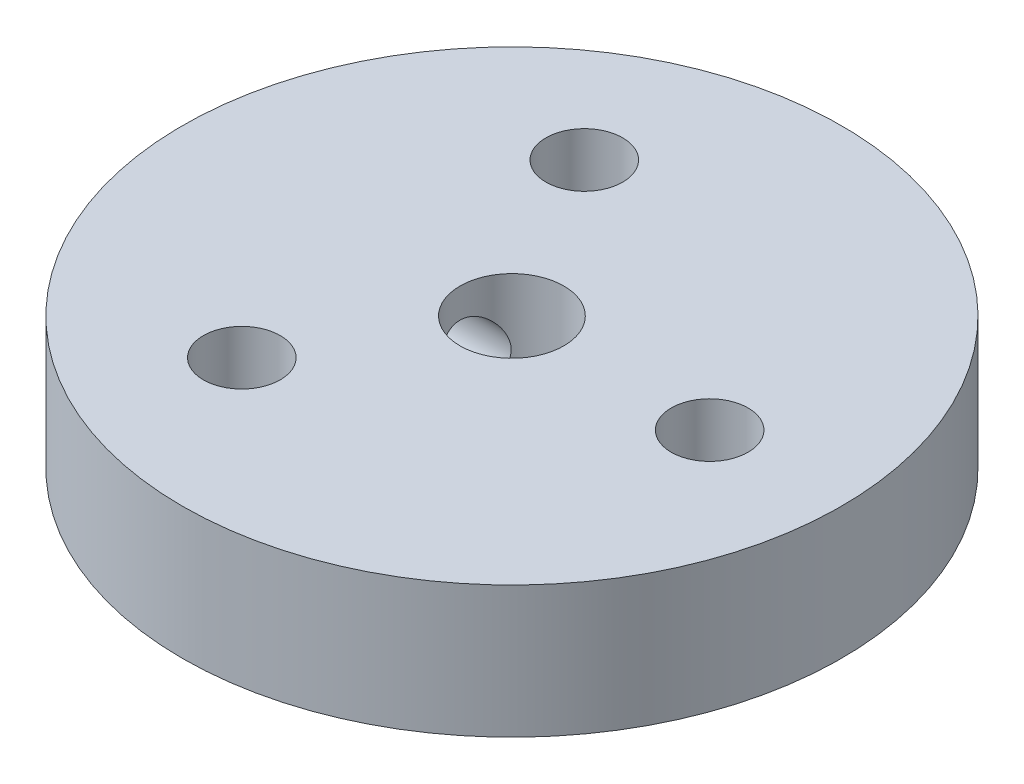
ISO-10303-21;
HEADER;
FILE_DESCRIPTION(('STEP AP214'),'2;1');
FILE_NAME('part.step','',(''),(''),'','','');
FILE_SCHEMA(('AUTOMOTIVE_DESIGN { 1 0 10303 214 1 1 1 1 }'));
ENDSEC;
DATA;
#1=APPLICATION_CONTEXT('core data for automotive mechanical design processes');
#2=APPLICATION_PROTOCOL_DEFINITION('international standard','automotive_design',2000,#1);
#3=PRODUCT_CONTEXT('',#1,'mechanical');
#4=PRODUCT('Part','Part','',(#3));
#5=PRODUCT_RELATED_PRODUCT_CATEGORY('part','',(#4));
#6=PRODUCT_DEFINITION_FORMATION('','',#4);
#7=PRODUCT_DEFINITION_CONTEXT('part definition',#1,'design');
#8=PRODUCT_DEFINITION('design','',#6,#7);
#9=PRODUCT_DEFINITION_SHAPE('','',#8);
#10=(LENGTH_UNIT() NAMED_UNIT(*) SI_UNIT(.MILLI.,.METRE.));
#11=(NAMED_UNIT(*) PLANE_ANGLE_UNIT() SI_UNIT($,.RADIAN.));
#12=(NAMED_UNIT(*) SI_UNIT($,.STERADIAN.) SOLID_ANGLE_UNIT());
#13=UNCERTAINTY_MEASURE_WITH_UNIT(LENGTH_MEASURE(1.E-05),#10,'distance_accuracy_value','');
#14=(GEOMETRIC_REPRESENTATION_CONTEXT(3) GLOBAL_UNCERTAINTY_ASSIGNED_CONTEXT((#13)) GLOBAL_UNIT_ASSIGNED_CONTEXT((#10,
#11,#12)) REPRESENTATION_CONTEXT('',''));
#15=CARTESIAN_POINT('',(0.,0.,0.));
#16=DIRECTION('',(0.,0.,1.));
#17=DIRECTION('',(1.,0.,0.));
#18=AXIS2_PLACEMENT_3D('',#15,#16,#17);
#19=CARTESIAN_POINT('',(0.,3.175,0.));
#20=DIRECTION('',(0.,1.,0.));
#21=DIRECTION('',(0.,0.,1.));
#22=AXIS2_PLACEMENT_3D('',#19,#20,#21);
#23=PLANE('',#22);
#24=CARTESIAN_POINT('',(-4.76249999999999,3.175,8.24889197104678));
#25=DIRECTION('',(0.,1.,0.));
#26=DIRECTION('',(0.,0.,1.));
#27=AXIS2_PLACEMENT_3D('',#24,#25,#26);
#28=CIRCLE('',#27,1.849999983);
#29=CARTESIAN_POINT('',(-4.76249999999999,3.175,10.0988919540468));
#30=VERTEX_POINT('',#29);
#31=EDGE_CURVE('E65',#30,#30,#28,.T.);
#32=ORIENTED_EDGE('',*,*,#31,.F.);
#33=EDGE_LOOP('',(#32));
#34=FACE_BOUND('',#33,.T.);
#35=CARTESIAN_POINT('',(0.,3.175,0.));
#36=DIRECTION('',(0.,1.,0.));
#37=DIRECTION('',(0.,0.,1.));
#38=AXIS2_PLACEMENT_3D('',#35,#36,#37);
#39=CIRCLE('',#38,2.499999953);
#40=CARTESIAN_POINT('',(0.,3.175,2.499999953));
#41=VERTEX_POINT('',#40);
#42=EDGE_CURVE('E54',#41,#41,#39,.T.);
#43=ORIENTED_EDGE('',*,*,#42,.F.);
#44=EDGE_LOOP('',(#43));
#45=FACE_BOUND('',#44,.T.);
#46=CARTESIAN_POINT('',(0.,3.175,0.));
#47=DIRECTION('',(0.,1.,0.));
#48=DIRECTION('',(0.,0.,1.));
#49=AXIS2_PLACEMENT_3D('',#46,#47,#48);
#50=CIRCLE('',#49,15.875);
#51=CARTESIAN_POINT('',(0.,3.175,15.875));
#52=VERTEX_POINT('',#51);
#53=EDGE_CURVE('E10',#52,#52,#50,.T.);
#54=ORIENTED_EDGE('',*,*,#53,.T.);
#55=EDGE_LOOP('',(#54));
#56=FACE_BOUND('',#55,.T.);
#57=CARTESIAN_POINT('',(9.525,3.175,0.));
#58=DIRECTION('',(0.,1.,0.));
#59=DIRECTION('',(0.,0.,1.));
#60=AXIS2_PLACEMENT_3D('',#57,#58,#59);
#61=CIRCLE('',#60,1.849999983);
#62=CARTESIAN_POINT('',(9.525,3.175,1.849999983));
#63=VERTEX_POINT('',#62);
#64=EDGE_CURVE('E59',#63,#63,#61,.T.);
#65=ORIENTED_EDGE('',*,*,#64,.F.);
#66=EDGE_LOOP('',(#65));
#67=FACE_BOUND('',#66,.T.);
#68=CARTESIAN_POINT('',(-4.7625,3.175,-8.24889197104678));
#69=DIRECTION('',(0.,1.,0.));
#70=DIRECTION('',(0.,0.,1.));
#71=AXIS2_PLACEMENT_3D('',#68,#69,#70);
#72=CIRCLE('',#71,1.849999983);
#73=CARTESIAN_POINT('',(-4.7625,3.175,-6.39889198804678));
#74=VERTEX_POINT('',#73);
#75=EDGE_CURVE('E71',#74,#74,#72,.T.);
#76=ORIENTED_EDGE('',*,*,#75,.F.);
#77=EDGE_LOOP('',(#76));
#78=FACE_BOUND('',#77,.T.);
#79=ADVANCED_FACE('F35',(#34,#45,#56,#67,#78),#23,.T.);
#80=CARTESIAN_POINT('',(0.,-3.175,0.));
#81=DIRECTION('',(0.,1.,0.));
#82=DIRECTION('',(0.,0.,1.));
#83=AXIS2_PLACEMENT_3D('',#80,#81,#82);
#84=PLANE('',#83);
#85=CARTESIAN_POINT('',(0.,-3.175,0.));
#86=DIRECTION('',(0.,1.,0.));
#87=DIRECTION('',(0.,0.,1.));
#88=AXIS2_PLACEMENT_3D('',#85,#86,#87);
#89=CIRCLE('',#88,15.875);
#90=CARTESIAN_POINT('',(0.,-3.175,15.875));
#91=VERTEX_POINT('',#90);
#92=EDGE_CURVE('E49',#91,#91,#89,.T.);
#93=ORIENTED_EDGE('',*,*,#92,.F.);
#94=EDGE_LOOP('',(#93));
#95=FACE_BOUND('',#94,.T.);
#96=CARTESIAN_POINT('',(0.,-3.175,0.));
#97=DIRECTION('',(0.,1.,0.));
#98=DIRECTION('',(0.,0.,1.));
#99=AXIS2_PLACEMENT_3D('',#96,#97,#98);
#100=CIRCLE('',#99,2.499999953);
#101=CARTESIAN_POINT('',(0.,-3.175,2.499999953));
#102=VERTEX_POINT('',#101);
#103=EDGE_CURVE('E56',#102,#102,#100,.T.);
#104=ORIENTED_EDGE('',*,*,#103,.T.);
#105=EDGE_LOOP('',(#104));
#106=FACE_BOUND('',#105,.T.);
#107=CARTESIAN_POINT('',(9.525,-3.175,0.));
#108=DIRECTION('',(0.,1.,0.));
#109=DIRECTION('',(0.,0.,1.));
#110=AXIS2_PLACEMENT_3D('',#107,#108,#109);
#111=CIRCLE('',#110,1.849999983);
#112=CARTESIAN_POINT('',(9.525,-3.175,1.849999983));
#113=VERTEX_POINT('',#112);
#114=EDGE_CURVE('E62',#113,#113,#111,.T.);
#115=ORIENTED_EDGE('',*,*,#114,.T.);
#116=EDGE_LOOP('',(#115));
#117=FACE_BOUND('',#116,.T.);
#118=CARTESIAN_POINT('',(-4.76249999999999,-3.175,8.24889197104678));
#119=DIRECTION('',(0.,1.,0.));
#120=DIRECTION('',(0.,0.,1.));
#121=AXIS2_PLACEMENT_3D('',#118,#119,#120);
#122=CIRCLE('',#121,1.849999983);
#123=CARTESIAN_POINT('',(-4.76249999999999,-3.175,10.0988919540468));
#124=VERTEX_POINT('',#123);
#125=EDGE_CURVE('E68',#124,#124,#122,.T.);
#126=ORIENTED_EDGE('',*,*,#125,.T.);
#127=EDGE_LOOP('',(#126));
#128=FACE_BOUND('',#127,.T.);
#129=CARTESIAN_POINT('',(-4.7625,-3.175,-8.24889197104678));
#130=DIRECTION('',(0.,1.,0.));
#131=DIRECTION('',(0.,0.,1.));
#132=AXIS2_PLACEMENT_3D('',#129,#130,#131);
#133=CIRCLE('',#132,1.849999983);
#134=CARTESIAN_POINT('',(-4.7625,-3.175,-6.39889198804678));
#135=VERTEX_POINT('',#134);
#136=EDGE_CURVE('E74',#135,#135,#133,.T.);
#137=ORIENTED_EDGE('',*,*,#136,.T.);
#138=EDGE_LOOP('',(#137));
#139=FACE_BOUND('',#138,.T.);
#140=ADVANCED_FACE('F107',(#95,#106,#117,#128,#139),#84,.F.);
#141=CARTESIAN_POINT('',(0.,3.175,0.));
#142=DIRECTION('',(0.,-1.,0.));
#143=DIRECTION('',(0.,0.,-1.));
#144=AXIS2_PLACEMENT_3D('',#141,#142,#143);
#145=CYLINDRICAL_SURFACE('',#144,15.875);
#146=CARTESIAN_POINT('',(-15.875,-1.750000056,0.));
#147=CARTESIAN_POINT('',(-15.8749987707504,-1.74999584185086,-0.0979793643530249));
#148=CARTESIAN_POINT('',(-15.8740833013667,-1.74174380277529,-0.196022150233042));
#149=CARTESIAN_POINT('',(-15.8705193526468,-1.70895155045262,-0.389385738105229));
#150=CARTESIAN_POINT('',(-15.8678690022144,-1.68439375077809,-0.484703485127764));
#151=CARTESIAN_POINT('',(-15.8611342387205,-1.61971693962202,-0.669789190422526));
#152=CARTESIAN_POINT('',(-15.8570507300743,-1.57960774040858,-0.75956060686708));
#153=CARTESIAN_POINT('',(-15.8479053217718,-1.48498669228053,-0.931078842194836));
#154=CARTESIAN_POINT('',(-15.8428436064379,-1.43047755602138,-1.01282716849133));
#155=CARTESIAN_POINT('',(-15.832283565769,-1.30835104975384,-1.16635129833459));
#156=CARTESIAN_POINT('',(-15.8267836315471,-1.24068392637024,-1.23808741687249));
#157=CARTESIAN_POINT('',(-15.8159802044649,-1.0942687401302,-1.36920942645987));
#158=CARTESIAN_POINT('',(-15.8106767210424,-1.01552014577331,-1.42859472478838));
#159=CARTESIAN_POINT('',(-15.8008505262322,-0.848924993605343,-1.53347299357972));
#160=CARTESIAN_POINT('',(-15.7963298762098,-0.76105536173159,-1.578929521488));
#161=CARTESIAN_POINT('',(-15.7886017252672,-0.578871890849666,-1.65442720826407));
#162=CARTESIAN_POINT('',(-15.7853941853144,-0.484558243488575,-1.68446882535031));
#163=CARTESIAN_POINT('',(-15.7806703494868,-0.292571858113271,-1.72816501837791));
#164=CARTESIAN_POINT('',(-15.7791472082895,-0.194914391305205,-1.74188593824553));
#165=CARTESIAN_POINT('',(-15.7779435139746,0.00132818929405485,-1.75275641347327));
#166=CARTESIAN_POINT('',(-15.7782629026333,0.099913273674305,-1.74990649247097));
#167=CARTESIAN_POINT('',(-15.7807019224249,0.29475337547144,-1.72777077884379));
#168=CARTESIAN_POINT('',(-15.7828135924459,0.391016764007342,-1.70855766836944));
#169=CARTESIAN_POINT('',(-15.7885868189893,0.57894442529153,-1.65435417633734));
#170=CARTESIAN_POINT('',(-15.7922484004842,0.670608623910321,-1.61936354056901));
#171=CARTESIAN_POINT('',(-15.8007179991703,0.846964040160319,-1.53451883504015));
#172=CARTESIAN_POINT('',(-15.8055284794751,0.931639743090616,-1.48463277281854));
#173=CARTESIAN_POINT('',(-15.8157518516358,1.09144467320651,-1.37143624395736));
#174=CARTESIAN_POINT('',(-15.8211647649281,1.16657356048189,-1.30812529954477));
#175=CARTESIAN_POINT('',(-15.8320185581079,1.30557439659657,-1.16947142581752));
#176=CARTESIAN_POINT('',(-15.8374594322491,1.36938379519243,-1.09406577254533));
#177=CARTESIAN_POINT('',(-15.847728784908,1.48344868087205,-0.933580066232353));
#178=CARTESIAN_POINT('',(-15.8525572624945,1.53370414734709,-0.848499998481936));
#179=CARTESIAN_POINT('',(-15.8610598804911,1.61923306738655,-0.671035359528453));
#180=CARTESIAN_POINT('',(-15.8647337544272,1.65450306307491,-0.578649108260965));
#181=CARTESIAN_POINT('',(-15.8705106365117,1.70901255824955,-0.389216300339645));
#182=CARTESIAN_POINT('',(-15.8726137017834,1.72825264067658,-0.292169913291171));
#183=CARTESIAN_POINT('',(-15.8750046399331,1.75007614450582,-0.096712983575378));
#184=CARTESIAN_POINT('',(-15.8753019126916,1.75274582314955,0.00168781785082944));
#185=CARTESIAN_POINT('',(-15.874073043414,1.7415797036682,0.197535415328228));
#186=CARTESIAN_POINT('',(-15.87254693142,1.72774417748232,0.294982227070652));
#187=CARTESIAN_POINT('',(-15.8678487150653,1.68403198885939,0.485904597899955));
#188=CARTESIAN_POINT('',(-15.8646807847588,1.65419599832553,0.579389580350867));
#189=CARTESIAN_POINT('',(-15.8570540340655,1.57937179861591,0.760028235948189));
#190=CARTESIAN_POINT('',(-15.8525951789162,1.53438318140011,0.847181738519446));
#191=CARTESIAN_POINT('',(-15.8428612389217,1.43031887501327,1.01307164683578));
#192=CARTESIAN_POINT('',(-15.8375829201735,1.37118684809846,1.09177251849359));
#193=CARTESIAN_POINT('',(-15.8268119373787,1.24059462690878,1.23816274044449));
#194=CARTESIAN_POINT('',(-15.8213192667711,1.1691340550484,1.30585175335472));
#195=CARTESIAN_POINT('',(-15.8107100734737,1.01553547987193,1.42859882917763));
#196=CARTESIAN_POINT('',(-15.805595310404,0.933351921211562,1.48360006057013));
#197=CARTESIAN_POINT('',(-15.7963487008554,0.760863550385964,1.57901887096793));
#198=CARTESIAN_POINT('',(-15.7922168384741,0.6705588696452,1.61943668592425));
#199=CARTESIAN_POINT('',(-15.7854152753184,0.484582147472773,1.68444740085582));
#200=CARTESIAN_POINT('',(-15.7827425148824,0.388921804954169,1.70907343448263));
#201=CARTESIAN_POINT('',(-15.7791525789664,0.194792749055371,1.74190875954436));
#202=CARTESIAN_POINT('',(-15.7782353412616,0.0963241353404615,1.75011863285375));
#203=CARTESIAN_POINT('',(-15.7782618172443,-0.100061266541459,1.74987952324859));
#204=CARTESIAN_POINT('',(-15.7791955582548,-0.197978176891494,1.74151981373045));
#205=CARTESIAN_POINT('',(-15.7827974525154,-0.391007035651755,1.70856673640226));
#206=CARTESIAN_POINT('',(-15.7854656071144,-0.486118981880618,1.68397335596795));
#207=CARTESIAN_POINT('',(-15.7922328084822,-0.670833051399155,1.61927697921681));
#208=CARTESIAN_POINT('',(-15.7963315528257,-0.760436334510245,1.57917726073254));
#209=CARTESIAN_POINT('',(-15.8054986823344,-0.931655560551822,1.48461545462339));
#210=CARTESIAN_POINT('',(-15.8105670688637,-1.01327149224439,1.43015334679154));
#211=CARTESIAN_POINT('',(-15.8211351459263,-1.16665650117076,1.30807874455527));
#212=CARTESIAN_POINT('',(-15.826636932568,-1.23837243958712,1.24039966058607));
#213=CARTESIAN_POINT('',(-15.8374329558805,-1.36946626129314,1.09394780586495));
#214=CARTESIAN_POINT('',(-15.8427271428449,-1.42884120419813,1.01517239876964));
#215=CARTESIAN_POINT('',(-15.8525284351924,-1.53371293329698,0.848499748931197));
#216=CARTESIAN_POINT('',(-15.8570331331814,-1.57916757669441,0.760575865487707));
#217=CARTESIAN_POINT('',(-15.8647225791226,-1.65460517533266,0.578347062586761));
#218=CARTESIAN_POINT('',(-15.8679087939638,-1.68460533373755,0.484049371034498));
#219=CARTESIAN_POINT('',(-15.8718140508065,-1.72091570865995,0.324362345388978));
#220=CARTESIAN_POINT('',(-15.8730031159235,-1.73180714458004,0.25998886124424));
#221=CARTESIAN_POINT('',(-15.8745964975978,-1.74635070179433,0.130419616769645));
#222=CARTESIAN_POINT('',(-15.8750008182989,-1.75000286131598,0.0652238607836776));
#223=CARTESIAN_POINT('',(-15.875,-1.750000056,0.));
#224=B_SPLINE_CURVE_WITH_KNOTS('',3,(#146,#147,#148,#149,#150,#151,#152,#153,#154,#155,#156,
#157,#158,#159,#160,#161,#162,#163,#164,#165,#166,#167,#168,#169,#170,#171,#172,#173,#174,#175,
#176,#177,#178,#179,#180,#181,#182,#183,#184,#185,#186,#187,#188,#189,#190,#191,#192,#193,#194,
#195,#196,#197,#198,#199,#200,#201,#202,#203,#204,#205,#206,#207,#208,#209,#210,#211,#212,#213,
#214,#215,#216,#217,#218,#219,#220,#221,#222,#223),.UNSPECIFIED.,.T.,.F.,(4,2,2,2,2,2,2,2,2,2,2,
2,2,2,2,2,2,2,2,2,2,2,2,2,2,2,2,2,2,2,2,2,2,2,2,2,2,2,4),(0.,0.293699894116223,
0.587717071206363,0.881549037129714,1.17532569050457,1.47023557519066,1.76515960946012,
2.06084880673068,2.3565292139345,2.65100352198026,2.94546852470618,3.23863235130914,
3.53180090159398,3.82560370616381,4.11941696852504,4.41480640062226,4.71019628185575,
5.00565428691476,5.30110154693553,5.59500955739081,5.88891272549456,6.18207233192447,
6.475239833383,6.76959515519251,7.06395949380344,7.3596178087775,7.65527133996119,
7.95030249595024,8.24532319430869,8.53875870419187,8.83219444226791,9.12556818582979,
9.41894234215225,9.71383458954611,10.0087970180838,10.3046437941381,10.6001605327694,
10.7956745809476,10.9911875966985),.UNSPECIFIED.);
#225=CARTESIAN_POINT('',(-15.875,-1.750000056,0.));
#226=VERTEX_POINT('',#225);
#227=EDGE_CURVE('E77',#226,#226,#224,.T.);
#228=ORIENTED_EDGE('',*,*,#227,.T.);
#229=EDGE_LOOP('',(#228));
#230=FACE_BOUND('',#229,.T.);
#231=ORIENTED_EDGE('',*,*,#53,.F.);
#232=EDGE_LOOP('',(#231));
#233=FACE_BOUND('',#232,.T.);
#234=ORIENTED_EDGE('',*,*,#92,.T.);
#235=EDGE_LOOP('',(#234));
#236=FACE_BOUND('',#235,.T.);
#237=ADVANCED_FACE('F37',(#230,#233,#236),#145,.T.);
#238=CARTESIAN_POINT('',(0.,3.175,0.));
#239=DIRECTION('',(0.,-1.,0.));
#240=DIRECTION('',(0.,0.,-1.));
#241=AXIS2_PLACEMENT_3D('',#238,#239,#240);
#242=CYLINDRICAL_SURFACE('',#241,2.499999953);
#243=CARTESIAN_POINT('',(-1.78535698643156,0.,-1.750000056));
#244=CARTESIAN_POINT('',(-1.78536353160684,0.0840009862376694,-1.74999674071223));
#245=CARTESIAN_POINT('',(-1.79140289005451,0.168020441562607,-1.74389526812276));
#246=CARTESIAN_POINT('',(-1.81428196053339,0.332943841578731,-1.72006716194955));
#247=CARTESIAN_POINT('',(-1.83114568410368,0.413840434860148,-1.70231468112262));
#248=CARTESIAN_POINT('',(-1.87249926755723,0.569514942858015,-1.65670504353427));
#249=CARTESIAN_POINT('',(-1.89690309611459,0.644350430591283,-1.62896132184663));
#250=CARTESIAN_POINT('',(-1.95043463035388,0.788133184100334,-1.56446810095859));
#251=CARTESIAN_POINT('',(-1.97956266497265,0.857080039351942,-1.52771797456944));
#252=CARTESIAN_POINT('',(-2.04535092334424,1.00034782595924,-1.43878627636313));
#253=CARTESIAN_POINT('',(-2.08243690603078,1.07349541386344,-1.38502935864329));
#254=CARTESIAN_POINT('',(-2.1564207321596,1.21078035386626,-1.2667785172882));
#255=CARTESIAN_POINT('',(-2.19331828562269,1.27490643185664,-1.20227137517678));
#256=CARTESIAN_POINT('',(-2.2699691649691,1.40296570024856,-1.05144380920934));
#257=CARTESIAN_POINT('',(-2.30917471093664,1.46508818111615,-0.963279743678919));
#258=CARTESIAN_POINT('',(-2.37911877937965,1.57301938685324,-0.774507191497755));
#259=CARTESIAN_POINT('',(-2.40987420704006,1.61886073812036,-0.673924143429612));
#260=CARTESIAN_POINT('',(-2.45245931674288,1.68149475615454,-0.491641658281999));
#261=CARTESIAN_POINT('',(-2.46715483216543,1.70278494864081,-0.412145290151232));
#262=CARTESIAN_POINT('',(-2.48881527088418,1.7340219095182,-0.249941886516342));
#263=CARTESIAN_POINT('',(-2.49578636657199,1.74397773509468,-0.167237469264432));
#264=CARTESIAN_POINT('',(-2.50138888439035,1.75198596784507,-0.000805981701546988));
#265=CARTESIAN_POINT('',(-2.50000410962763,1.75001525677839,0.0829227605929475));
#266=CARTESIAN_POINT('',(-2.48898575533895,1.73423812035354,0.248708344722488));
#267=CARTESIAN_POINT('',(-2.4793498755541,1.72042839449088,0.330764713798533));
#268=CARTESIAN_POINT('',(-2.45297590516598,1.68219405100126,0.489091661657778));
#269=CARTESIAN_POINT('',(-2.43640489589069,1.65801884318785,0.565451538680731));
#270=CARTESIAN_POINT('',(-2.39742412960482,1.60018691633619,0.712866111720709));
#271=CARTESIAN_POINT('',(-2.37501322563591,1.5665283346528,0.783919762061208));
#272=CARTESIAN_POINT('',(-2.32302565677279,1.48659829896808,0.927364941252995));
#273=CARTESIAN_POINT('',(-2.29292703783558,1.43933520673159,0.999011529654068));
#274=CARTESIAN_POINT('',(-2.22936299205402,1.33575197009653,1.13380162872956));
#275=CARTESIAN_POINT('',(-2.1958939538483,1.27942207123081,1.19693584546015));
#276=CARTESIAN_POINT('',(-2.12170402947656,1.14786844878418,1.32466885392253));
#277=CARTESIAN_POINT('',(-2.08075551208748,1.07106708517545,1.3875155687759));
#278=CARTESIAN_POINT('',(-2.00128397513863,0.90707550247114,1.49986259990245));
#279=CARTESIAN_POINT('',(-1.96276033081695,0.819887976225726,1.54936636482748));
#280=CARTESIAN_POINT('',(-1.90133160150142,0.657139157095294,1.62379390045516));
#281=CARTESIAN_POINT('',(-1.87687563694531,0.583562177458264,1.65175510639622));
#282=CARTESIAN_POINT('',(-1.83530085153893,0.431453142490078,1.69783363759576));
#283=CARTESIAN_POINT('',(-1.81816832181888,0.352930663818078,1.71596937250885));
#284=CARTESIAN_POINT('',(-1.79384384467562,0.19171004720726,1.74139488231661));
#285=CARTESIAN_POINT('',(-1.7867543349786,0.108977672211668,1.74857294672399));
#286=CARTESIAN_POINT('',(-1.78434042088011,-0.056828961830422,1.75103864622662));
#287=CARTESIAN_POINT('',(-1.78901172732784,-0.139903085209793,1.74633061615974));
#288=CARTESIAN_POINT('',(-1.80768747695056,-0.291790636324837,1.72696246458513));
#289=CARTESIAN_POINT('',(-1.82030450288525,-0.360981344484975,1.71377649609293));
#290=CARTESIAN_POINT('',(-1.85179977176652,-0.495961783793232,1.6796950702078));
#291=CARTESIAN_POINT('',(-1.8706846136517,-0.561747845690816,1.65879148486562));
#292=CARTESIAN_POINT('',(-1.92274145146181,-0.719229601753332,1.5985290510106));
#293=CARTESIAN_POINT('',(-1.95845299526844,-0.808531913299251,1.55511514099229));
#294=CARTESIAN_POINT('',(-2.03399586921551,-0.977427132676097,1.45492658079318));
#295=CARTESIAN_POINT('',(-2.07383516526639,-1.05700059542363,1.39812581647788));
#296=CARTESIAN_POINT('',(-2.15418657793027,-1.20710418905457,1.2709252101808));
#297=CARTESIAN_POINT('',(-2.19469720316951,-1.27743531414488,1.20028895636523));
#298=CARTESIAN_POINT('',(-2.2718540255458,-1.4058614669604,1.04691357933904));
#299=CARTESIAN_POINT('',(-2.30850584900416,-1.46397443625129,0.964192508965829));
#300=CARTESIAN_POINT('',(-2.36919517687531,-1.55776856959566,0.801973101313127));
#301=CARTESIAN_POINT('',(-2.39431359815501,-1.59555519901798,0.724101951456645));
#302=CARTESIAN_POINT('',(-2.43747675472513,-1.65962524685062,0.561900018164365));
#303=CARTESIAN_POINT('',(-2.45552578017796,-1.68591564304343,0.477573189712573));
#304=CARTESIAN_POINT('',(-2.48300651165062,-1.7256973104107,0.304026460542062));
#305=CARTESIAN_POINT('',(-2.49238842267052,-1.73911463898112,0.214781369053359));
#306=CARTESIAN_POINT('',(-2.50137823146471,-1.75197503588083,0.0348056382247454));
#307=CARTESIAN_POINT('',(-2.50098994175094,-1.75142355509579,-0.0559244078471138));
#308=CARTESIAN_POINT('',(-2.49101134268853,-1.73714057520822,-0.226908062025136));
#309=CARTESIAN_POINT('',(-2.48231384479638,-1.72468780305731,-0.307326833542795));
#310=CARTESIAN_POINT('',(-2.45773767681571,-1.68912396093751,-0.464612299555873));
#311=CARTESIAN_POINT('',(-2.44185764063502,-1.66601086339773,-0.54147831526356));
#312=CARTESIAN_POINT('',(-2.4034476493384,-1.60919685617914,-0.692629979232581));
#313=CARTESIAN_POINT('',(-2.38070433679196,-1.57515358407889,-0.766731062743777));
#314=CARTESIAN_POINT('',(-2.33039636326787,-1.49803230829202,-0.908240357330934));
#315=CARTESIAN_POINT('',(-2.30283076983556,-1.45495255695594,-0.975647270037383));
#316=CARTESIAN_POINT('',(-2.23999113384379,-1.35347557643788,-1.11310519341797));
#317=CARTESIAN_POINT('',(-2.2041857523867,-1.29373650278042,-1.18192127326262));
#318=CARTESIAN_POINT('',(-2.13102657128424,-1.16473204856133,-1.30924978101201));
#319=CARTESIAN_POINT('',(-2.09366966772873,-1.09544685896223,-1.36774019096965));
#320=CARTESIAN_POINT('',(-2.01471299550452,-0.936528140172117,-1.4820470931167));
#321=CARTESIAN_POINT('',(-1.9733700571894,-0.845408141485979,-1.53599601256594));
#322=CARTESIAN_POINT('',(-1.89871807376629,-0.652279648797655,-1.62737758020452));
#323=CARTESIAN_POINT('',(-1.86538481600573,-0.550305350425475,-1.66486029643272));
#324=CARTESIAN_POINT('',(-1.82254468003753,-0.372734825881567,-1.711427823351));
#325=CARTESIAN_POINT('',(-1.80880408337454,-0.299561617798117,-1.72580409762286));
#326=CARTESIAN_POINT('',(-1.79021507017803,-0.150927752494639,-1.7450834210073));
#327=CARTESIAN_POINT('',(-1.78535110586862,-0.0754713306127928,-1.75000303464573));
#328=CARTESIAN_POINT('',(-1.78535698643156,0.,-1.750000056));
#329=B_SPLINE_CURVE_WITH_KNOTS('',3,(#243,#244,#245,#246,#247,#248,#249,#250,#251,#252,#253,
#254,#255,#256,#257,#258,#259,#260,#261,#262,#263,#264,#265,#266,#267,#268,#269,#270,#271,#272,
#273,#274,#275,#276,#277,#278,#279,#280,#281,#282,#283,#284,#285,#286,#287,#288,#289,#290,#291,
#292,#293,#294,#295,#296,#297,#298,#299,#300,#301,#302,#303,#304,#305,#306,#307,#308,#309,#310,
#311,#312,#313,#314,#315,#316,#317,#318,#319,#320,#321,#322,#323,#324,#325,#326,#327,#328),
.UNSPECIFIED.,.T.,.F.,(4,2,2,2,2,2,2,2,2,2,2,2,2,2,2,2,2,2,2,2,2,2,2,2,2,2,2,2,2,2,2,2,2,2,2,2,
2,2,2,2,2,2,4),(0.,0.251644356197524,0.50384886986987,0.753275875722637,1.0027202561317,
1.29584809983489,1.58933906948074,1.9317081968959,2.27338731388753,2.52311140824716,
2.7726358100704,3.02264404140502,3.27272199321346,3.5170934655928,3.7615129688769,
4.03336583297327,4.30551314754178,4.62626335578384,4.94693058246351,5.19332753829732,
5.43926121763164,5.68768576384863,5.93601972315685,6.14983860408944,6.36388331765094,
6.67875955247792,6.99425518540468,7.31570484551782,7.63667912907743,7.9059514096605,
8.17506002443602,8.44570529923007,8.71624496490064,8.96064253725069,9.20508661267274,
9.4580890252256,9.7111404134758,10.0037639605953,10.2970041386452,10.6363671047705,
10.9746909198371,11.2011798089677,11.4272716116246),.UNSPECIFIED.);
#330=CARTESIAN_POINT('',(-1.78535698643156,0.,-1.750000056));
#331=VERTEX_POINT('',#330);
#332=EDGE_CURVE('E40',#331,#331,#329,.T.);
#333=ORIENTED_EDGE('',*,*,#332,.F.);
#334=EDGE_LOOP('',(#333));
#335=FACE_BOUND('',#334,.T.);
#336=ORIENTED_EDGE('',*,*,#42,.T.);
#337=EDGE_LOOP('',(#336));
#338=FACE_BOUND('',#337,.T.);
#339=ORIENTED_EDGE('',*,*,#103,.F.);
#340=EDGE_LOOP('',(#339));
#341=FACE_BOUND('',#340,.T.);
#342=ADVANCED_FACE('F100',(#335,#338,#341),#242,.F.);
#343=CARTESIAN_POINT('',(9.525,3.175,0.));
#344=DIRECTION('',(0.,-1.,0.));
#345=DIRECTION('',(0.,0.,-1.));
#346=AXIS2_PLACEMENT_3D('',#343,#344,#345);
#347=CYLINDRICAL_SURFACE('',#346,1.849999983);
#348=ORIENTED_EDGE('',*,*,#64,.T.);
#349=EDGE_LOOP('',(#348));
#350=FACE_BOUND('',#349,.T.);
#351=ORIENTED_EDGE('',*,*,#114,.F.);
#352=EDGE_LOOP('',(#351));
#353=FACE_BOUND('',#352,.T.);
#354=ADVANCED_FACE('F97',(#350,#353),#347,.F.);
#355=CARTESIAN_POINT('',(-4.76249999999999,3.175,8.24889197104678));
#356=DIRECTION('',(0.,-1.,0.));
#357=DIRECTION('',(0.,0.,-1.));
#358=AXIS2_PLACEMENT_3D('',#355,#356,#357);
#359=CYLINDRICAL_SURFACE('',#358,1.849999983);
#360=ORIENTED_EDGE('',*,*,#31,.T.);
#361=EDGE_LOOP('',(#360));
#362=FACE_BOUND('',#361,.T.);
#363=ORIENTED_EDGE('',*,*,#125,.F.);
#364=EDGE_LOOP('',(#363));
#365=FACE_BOUND('',#364,.T.);
#366=ADVANCED_FACE('F93',(#362,#365),#359,.F.);
#367=CARTESIAN_POINT('',(-4.7625,3.175,-8.24889197104678));
#368=DIRECTION('',(0.,-1.,0.));
#369=DIRECTION('',(0.,0.,-1.));
#370=AXIS2_PLACEMENT_3D('',#367,#368,#369);
#371=CYLINDRICAL_SURFACE('',#370,1.849999983);
#372=ORIENTED_EDGE('',*,*,#75,.T.);
#373=EDGE_LOOP('',(#372));
#374=FACE_BOUND('',#373,.T.);
#375=ORIENTED_EDGE('',*,*,#136,.F.);
#376=EDGE_LOOP('',(#375));
#377=FACE_BOUND('',#376,.T.);
#378=ADVANCED_FACE('F88',(#374,#377),#371,.F.);
#379=CARTESIAN_POINT('',(-15.875,0.,0.));
#380=DIRECTION('',(1.,0.,0.));
#381=DIRECTION('',(0.,0.,-1.));
#382=AXIS2_PLACEMENT_3D('',#379,#380,#381);
#383=CYLINDRICAL_SURFACE('',#382,1.750000056);
#384=ORIENTED_EDGE('',*,*,#332,.T.);
#385=EDGE_LOOP('',(#384));
#386=FACE_BOUND('',#385,.T.);
#387=ORIENTED_EDGE('',*,*,#227,.F.);
#388=EDGE_LOOP('',(#387));
#389=FACE_BOUND('',#388,.T.);
#390=ADVANCED_FACE('F84',(#386,#389),#383,.F.);
#391=CLOSED_SHELL('',(#79,#140,#237,#342,#354,#366,#378,#390));
#392=MANIFOLD_SOLID_BREP('B2',#391);
#393=ADVANCED_BREP_SHAPE_REPRESENTATION('',(#18,#392),#14);
#394=SHAPE_DEFINITION_REPRESENTATION(#9,#393);
ENDSEC;
END-ISO-10303-21;
